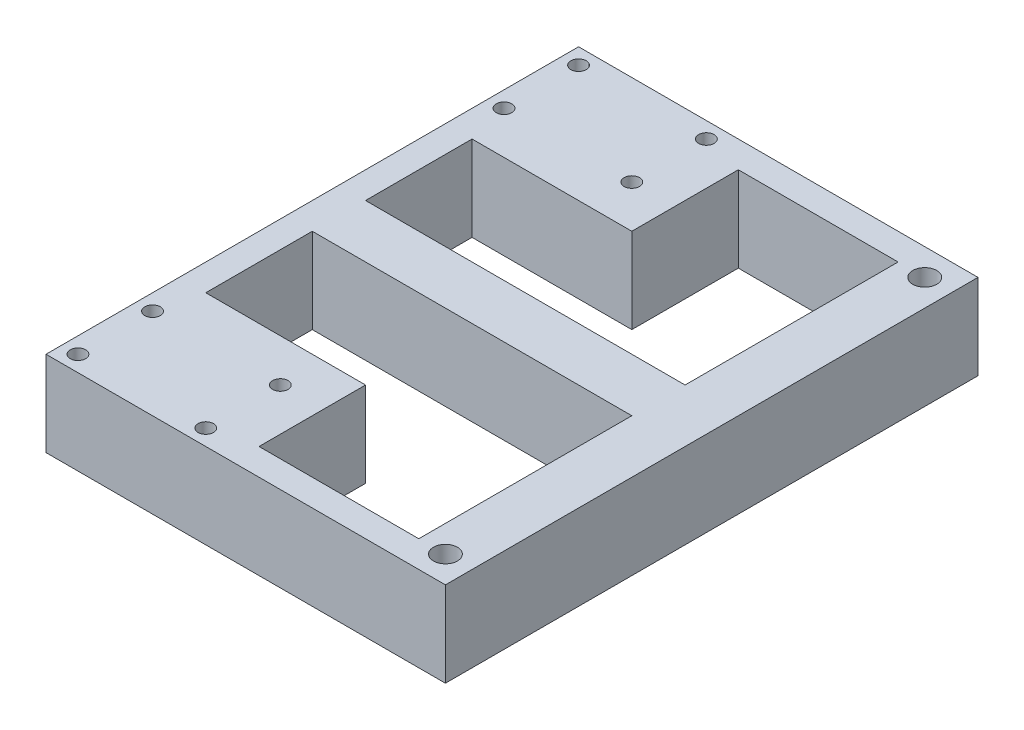
ISO-10303-21;
HEADER;
FILE_DESCRIPTION(('STEP AP214'),'2;1');
FILE_NAME('part.step','',(''),(''),'','','');
FILE_SCHEMA(('AUTOMOTIVE_DESIGN { 1 0 10303 214 1 1 1 1 }'));
ENDSEC;
DATA;
#1=APPLICATION_CONTEXT('core data for automotive mechanical design processes');
#2=APPLICATION_PROTOCOL_DEFINITION('international standard','automotive_design',2000,#1);
#3=PRODUCT_CONTEXT('',#1,'mechanical');
#4=PRODUCT('Part','Part','',(#3));
#5=PRODUCT_RELATED_PRODUCT_CATEGORY('part','',(#4));
#6=PRODUCT_DEFINITION_FORMATION('','',#4);
#7=PRODUCT_DEFINITION_CONTEXT('part definition',#1,'design');
#8=PRODUCT_DEFINITION('design','',#6,#7);
#9=PRODUCT_DEFINITION_SHAPE('','',#8);
#10=(LENGTH_UNIT() NAMED_UNIT(*) SI_UNIT(.MILLI.,.METRE.));
#11=(NAMED_UNIT(*) PLANE_ANGLE_UNIT() SI_UNIT($,.RADIAN.));
#12=(NAMED_UNIT(*) SI_UNIT($,.STERADIAN.) SOLID_ANGLE_UNIT());
#13=UNCERTAINTY_MEASURE_WITH_UNIT(LENGTH_MEASURE(1.E-05),#10,'distance_accuracy_value','');
#14=(GEOMETRIC_REPRESENTATION_CONTEXT(3) GLOBAL_UNCERTAINTY_ASSIGNED_CONTEXT((#13)) GLOBAL_UNIT_ASSIGNED_CONTEXT((#10,
#11,#12)) REPRESENTATION_CONTEXT('',''));
#15=CARTESIAN_POINT('',(0.,0.,0.));
#16=DIRECTION('',(0.,0.,1.));
#17=DIRECTION('',(1.,0.,0.));
#18=AXIS2_PLACEMENT_3D('',#15,#16,#17);
#19=CARTESIAN_POINT('',(0.,16.,0.));
#20=DIRECTION('',(-1.,0.,0.));
#21=DIRECTION('',(0.,0.,1.));
#22=AXIS2_PLACEMENT_3D('',#19,#20,#21);
#23=PLANE('',#22);
#24=DIRECTION('',(0.,0.,-1.));
#25=VECTOR('',#24,1.);
#26=CARTESIAN_POINT('',(0.,0.,0.));
#27=LINE('',#26,#25);
#28=CARTESIAN_POINT('',(0.,0.,0.));
#29=VERTEX_POINT('',#28);
#30=CARTESIAN_POINT('',(0.,0.,-100.));
#31=VERTEX_POINT('',#30);
#32=EDGE_CURVE('E211',#29,#31,#27,.T.);
#33=ORIENTED_EDGE('',*,*,#32,.T.);
#34=DIRECTION('',(0.,-1.,0.));
#35=VECTOR('',#34,1.);
#36=CARTESIAN_POINT('',(0.,16.,-100.));
#37=LINE('',#36,#35);
#38=CARTESIAN_POINT('',(0.,16.,-100.));
#39=VERTEX_POINT('',#38);
#40=EDGE_CURVE('E11',#39,#31,#37,.T.);
#41=ORIENTED_EDGE('',*,*,#40,.F.);
#42=DIRECTION('',(0.,0.,-1.));
#43=VECTOR('',#42,1.);
#44=CARTESIAN_POINT('',(0.,16.,0.));
#45=LINE('',#44,#43);
#46=CARTESIAN_POINT('',(0.,16.,0.));
#47=VERTEX_POINT('',#46);
#48=EDGE_CURVE('E200',#47,#39,#45,.T.);
#49=ORIENTED_EDGE('',*,*,#48,.F.);
#50=DIRECTION('',(0.,-1.,0.));
#51=VECTOR('',#50,1.);
#52=CARTESIAN_POINT('',(0.,16.,0.));
#53=LINE('',#52,#51);
#54=EDGE_CURVE('E210',#47,#29,#53,.T.);
#55=ORIENTED_EDGE('',*,*,#54,.T.);
#56=EDGE_LOOP('',(#33,#41,#49,#55));
#57=FACE_BOUND('',#56,.T.);
#58=ADVANCED_FACE('F34',(#57),#23,.F.);
#59=CARTESIAN_POINT('',(0.,16.,-100.));
#60=DIRECTION('',(0.,0.,1.));
#61=DIRECTION('',(1.,0.,0.));
#62=AXIS2_PLACEMENT_3D('',#59,#60,#61);
#63=PLANE('',#62);
#64=DIRECTION('',(-1.,0.,0.));
#65=VECTOR('',#64,1.);
#66=CARTESIAN_POINT('',(0.,0.,-100.));
#67=LINE('',#66,#65);
#68=CARTESIAN_POINT('',(-75.,0.,-100.));
#69=VERTEX_POINT('',#68);
#70=EDGE_CURVE('E214',#31,#69,#67,.T.);
#71=ORIENTED_EDGE('',*,*,#70,.T.);
#72=DIRECTION('',(0.,-1.,0.));
#73=VECTOR('',#72,1.);
#74=CARTESIAN_POINT('',(-75.,16.,-100.));
#75=LINE('',#74,#73);
#76=CARTESIAN_POINT('',(-75.,16.,-100.));
#77=VERTEX_POINT('',#76);
#78=EDGE_CURVE('E41',#77,#69,#75,.T.);
#79=ORIENTED_EDGE('',*,*,#78,.F.);
#80=DIRECTION('',(-1.,0.,0.));
#81=VECTOR('',#80,1.);
#82=CARTESIAN_POINT('',(0.,16.,-100.));
#83=LINE('',#82,#81);
#84=EDGE_CURVE('E203',#39,#77,#83,.T.);
#85=ORIENTED_EDGE('',*,*,#84,.F.);
#86=ORIENTED_EDGE('',*,*,#40,.T.);
#87=EDGE_LOOP('',(#71,#79,#85,#86));
#88=FACE_BOUND('',#87,.T.);
#89=ADVANCED_FACE('F243',(#88),#63,.F.);
#90=CARTESIAN_POINT('',(-75.,16.,0.));
#91=DIRECTION('',(1.,0.,0.));
#92=DIRECTION('',(0.,0.,-1.));
#93=AXIS2_PLACEMENT_3D('',#90,#91,#92);
#94=PLANE('',#93);
#95=DIRECTION('',(0.,0.,1.));
#96=VECTOR('',#95,1.);
#97=CARTESIAN_POINT('',(-75.,0.,0.));
#98=LINE('',#97,#96);
#99=CARTESIAN_POINT('',(-75.,0.,0.));
#100=VERTEX_POINT('',#99);
#101=EDGE_CURVE('E217',#69,#100,#98,.T.);
#102=ORIENTED_EDGE('',*,*,#101,.T.);
#103=DIRECTION('',(0.,-1.,0.));
#104=VECTOR('',#103,1.);
#105=CARTESIAN_POINT('',(-75.,16.,0.));
#106=LINE('',#105,#104);
#107=CARTESIAN_POINT('',(-75.,16.,0.));
#108=VERTEX_POINT('',#107);
#109=EDGE_CURVE('E222',#108,#100,#106,.T.);
#110=ORIENTED_EDGE('',*,*,#109,.F.);
#111=DIRECTION('',(0.,0.,1.));
#112=VECTOR('',#111,1.);
#113=CARTESIAN_POINT('',(-75.,16.,0.));
#114=LINE('',#113,#112);
#115=EDGE_CURVE('E206',#77,#108,#114,.T.);
#116=ORIENTED_EDGE('',*,*,#115,.F.);
#117=ORIENTED_EDGE('',*,*,#78,.T.);
#118=EDGE_LOOP('',(#102,#110,#116,#117));
#119=FACE_BOUND('',#118,.T.);
#120=ADVANCED_FACE('F229',(#119),#94,.F.);
#121=CARTESIAN_POINT('',(0.,16.,0.));
#122=DIRECTION('',(0.,0.,-1.));
#123=DIRECTION('',(-1.,0.,0.));
#124=AXIS2_PLACEMENT_3D('',#121,#122,#123);
#125=PLANE('',#124);
#126=DIRECTION('',(1.,0.,0.));
#127=VECTOR('',#126,1.);
#128=CARTESIAN_POINT('',(0.,0.,0.));
#129=LINE('',#128,#127);
#130=EDGE_CURVE('E204',#100,#29,#129,.T.);
#131=ORIENTED_EDGE('',*,*,#130,.T.);
#132=ORIENTED_EDGE('',*,*,#54,.F.);
#133=DIRECTION('',(1.,0.,0.));
#134=VECTOR('',#133,1.);
#135=CARTESIAN_POINT('',(0.,16.,0.));
#136=LINE('',#135,#134);
#137=EDGE_CURVE('E208',#108,#47,#136,.T.);
#138=ORIENTED_EDGE('',*,*,#137,.F.);
#139=ORIENTED_EDGE('',*,*,#109,.T.);
#140=EDGE_LOOP('',(#131,#132,#138,#139));
#141=FACE_BOUND('',#140,.T.);
#142=ADVANCED_FACE('F236',(#141),#125,.F.);
#143=CARTESIAN_POINT('',(0.,16.,0.));
#144=DIRECTION('',(0.,1.,0.));
#145=DIRECTION('',(0.,0.,1.));
#146=AXIS2_PLACEMENT_3D('',#143,#144,#145);
#147=PLANE('',#146);
#148=CARTESIAN_POINT('',(-5.,16.,-95.));
#149=DIRECTION('',(0.,1.,0.));
#150=DIRECTION('',(0.,0.,1.));
#151=AXIS2_PLACEMENT_3D('',#148,#149,#150);
#152=CIRCLE('',#151,2.25);
#153=CARTESIAN_POINT('',(-5.,16.,-92.75));
#154=VERTEX_POINT('',#153);
#155=EDGE_CURVE('E387',#154,#154,#152,.T.);
#156=ORIENTED_EDGE('',*,*,#155,.F.);
#157=EDGE_LOOP('',(#156));
#158=FACE_BOUND('',#157,.T.);
#159=CARTESIAN_POINT('',(-5.,16.,-5.));
#160=DIRECTION('',(0.,1.,0.));
#161=DIRECTION('',(0.,0.,-1.));
#162=AXIS2_PLACEMENT_3D('',#159,#160,#161);
#163=CIRCLE('',#162,2.25);
#164=CARTESIAN_POINT('',(-5.,16.,-7.25));
#165=VERTEX_POINT('',#164);
#166=EDGE_CURVE('E370',#165,#165,#163,.T.);
#167=ORIENTED_EDGE('',*,*,#166,.F.);
#168=EDGE_LOOP('',(#167));
#169=FACE_BOUND('',#168,.T.);
#170=DIRECTION('',(-1.,0.,0.));
#171=VECTOR('',#170,1.);
#172=CARTESIAN_POINT('',(-40.,16.,-95.));
#173=LINE('',#172,#171);
#174=CARTESIAN_POINT('',(-9.99999999999999,16.,-95.));
#175=VERTEX_POINT('',#174);
#176=CARTESIAN_POINT('',(-40.,16.,-95.));
#177=VERTEX_POINT('',#176);
#178=EDGE_CURVE('E186',#175,#177,#173,.T.);
#179=ORIENTED_EDGE('',*,*,#178,.F.);
#180=DIRECTION('',(0.,0.,-1.));
#181=VECTOR('',#180,1.);
#182=CARTESIAN_POINT('',(-10.,16.,-55.));
#183=LINE('',#182,#181);
#184=CARTESIAN_POINT('',(-10.,16.,-55.));
#185=VERTEX_POINT('',#184);
#186=EDGE_CURVE('E159',#185,#175,#183,.T.);
#187=ORIENTED_EDGE('',*,*,#186,.F.);
#188=DIRECTION('',(1.,0.,0.));
#189=VECTOR('',#188,1.);
#190=CARTESIAN_POINT('',(-40.,16.,-55.));
#191=LINE('',#190,#189);
#192=CARTESIAN_POINT('',(-70.,16.,-55.));
#193=VERTEX_POINT('',#192);
#194=EDGE_CURVE('E183',#193,#185,#191,.T.);
#195=ORIENTED_EDGE('',*,*,#194,.F.);
#196=DIRECTION('',(0.,0.,1.));
#197=VECTOR('',#196,1.);
#198=CARTESIAN_POINT('',(-70.,16.,-55.));
#199=LINE('',#198,#197);
#200=CARTESIAN_POINT('',(-70.,16.,-75.));
#201=VERTEX_POINT('',#200);
#202=EDGE_CURVE('E180',#201,#193,#199,.T.);
#203=ORIENTED_EDGE('',*,*,#202,.F.);
#204=DIRECTION('',(-1.,0.,0.));
#205=VECTOR('',#204,1.);
#206=CARTESIAN_POINT('',(-40.,16.,-75.));
#207=LINE('',#206,#205);
#208=CARTESIAN_POINT('',(-40.,16.,-75.));
#209=VERTEX_POINT('',#208);
#210=EDGE_CURVE('E177',#209,#201,#207,.T.);
#211=ORIENTED_EDGE('',*,*,#210,.F.);
#212=DIRECTION('',(0.,0.,1.));
#213=VECTOR('',#212,1.);
#214=CARTESIAN_POINT('',(-40.,16.,-75.));
#215=LINE('',#214,#213);
#216=EDGE_CURVE('E170',#177,#209,#215,.T.);
#217=ORIENTED_EDGE('',*,*,#216,.F.);
#218=EDGE_LOOP('',(#179,#187,#195,#203,#211,#217));
#219=FACE_BOUND('',#218,.T.);
#220=DIRECTION('',(-1.,0.,0.));
#221=VECTOR('',#220,1.);
#222=CARTESIAN_POINT('',(-40.,16.,-45.));
#223=LINE('',#222,#221);
#224=CARTESIAN_POINT('',(-10.,16.,-45.));
#225=VERTEX_POINT('',#224);
#226=CARTESIAN_POINT('',(-70.,16.,-45.));
#227=VERTEX_POINT('',#226);
#228=EDGE_CURVE('E470',#225,#227,#223,.T.);
#229=ORIENTED_EDGE('',*,*,#228,.F.);
#230=DIRECTION('',(0.,0.,-1.));
#231=VECTOR('',#230,1.);
#232=CARTESIAN_POINT('',(-10.,16.,-4.99999999999999));
#233=LINE('',#232,#231);
#234=CARTESIAN_POINT('',(-10.,16.,-4.99999999999999));
#235=VERTEX_POINT('',#234);
#236=EDGE_CURVE('E399',#235,#225,#233,.T.);
#237=ORIENTED_EDGE('',*,*,#236,.F.);
#238=DIRECTION('',(1.,0.,0.));
#239=VECTOR('',#238,1.);
#240=CARTESIAN_POINT('',(-40.,16.,-4.99999999999999));
#241=LINE('',#240,#239);
#242=CARTESIAN_POINT('',(-40.,16.,-4.99999999999999));
#243=VERTEX_POINT('',#242);
#244=EDGE_CURVE('E467',#243,#235,#241,.T.);
#245=ORIENTED_EDGE('',*,*,#244,.F.);
#246=DIRECTION('',(0.,0.,1.));
#247=VECTOR('',#246,1.);
#248=CARTESIAN_POINT('',(-40.,16.,-25.));
#249=LINE('',#248,#247);
#250=CARTESIAN_POINT('',(-40.,16.,-25.));
#251=VERTEX_POINT('',#250);
#252=EDGE_CURVE('E464',#251,#243,#249,.T.);
#253=ORIENTED_EDGE('',*,*,#252,.F.);
#254=DIRECTION('',(1.,0.,0.));
#255=VECTOR('',#254,1.);
#256=CARTESIAN_POINT('',(-40.,16.,-25.));
#257=LINE('',#256,#255);
#258=CARTESIAN_POINT('',(-70.,16.,-25.));
#259=VERTEX_POINT('',#258);
#260=EDGE_CURVE('E461',#259,#251,#257,.T.);
#261=ORIENTED_EDGE('',*,*,#260,.F.);
#262=DIRECTION('',(0.,0.,1.));
#263=VECTOR('',#262,1.);
#264=CARTESIAN_POINT('',(-70.,16.,-45.));
#265=LINE('',#264,#263);
#266=EDGE_CURVE('E458',#227,#259,#265,.T.);
#267=ORIENTED_EDGE('',*,*,#266,.F.);
#268=EDGE_LOOP('',(#229,#237,#245,#253,#261,#267));
#269=FACE_BOUND('',#268,.T.);
#270=CARTESIAN_POINT('',(-48.,16.,-17.));
#271=DIRECTION('',(0.,1.,0.));
#272=DIRECTION('',(0.,0.,-1.));
#273=AXIS2_PLACEMENT_3D('',#270,#271,#272);
#274=CIRCLE('',#273,1.45);
#275=CARTESIAN_POINT('',(-48.,16.,-18.45));
#276=VERTEX_POINT('',#275);
#277=EDGE_CURVE('E411',#276,#276,#274,.T.);
#278=ORIENTED_EDGE('',*,*,#277,.F.);
#279=EDGE_LOOP('',(#278));
#280=FACE_BOUND('',#279,.T.);
#281=CARTESIAN_POINT('',(-48.,16.,-83.));
#282=DIRECTION('',(0.,1.,0.));
#283=DIRECTION('',(0.,0.,1.));
#284=AXIS2_PLACEMENT_3D('',#281,#282,#283);
#285=CIRCLE('',#284,1.45);
#286=CARTESIAN_POINT('',(-48.,16.,-81.55));
#287=VERTEX_POINT('',#286);
#288=EDGE_CURVE('E424',#287,#287,#285,.T.);
#289=ORIENTED_EDGE('',*,*,#288,.F.);
#290=EDGE_LOOP('',(#289));
#291=FACE_BOUND('',#290,.T.);
#292=CARTESIAN_POINT('',(-48.,16.,-97.));
#293=DIRECTION('',(0.,1.,0.));
#294=DIRECTION('',(0.,0.,1.));
#295=AXIS2_PLACEMENT_3D('',#292,#293,#294);
#296=CIRCLE('',#295,1.45);
#297=CARTESIAN_POINT('',(-48.,16.,-95.55));
#298=VERTEX_POINT('',#297);
#299=EDGE_CURVE('E423',#298,#298,#296,.T.);
#300=ORIENTED_EDGE('',*,*,#299,.F.);
#301=EDGE_LOOP('',(#300));
#302=FACE_BOUND('',#301,.T.);
#303=CARTESIAN_POINT('',(-72.,16.,-83.));
#304=DIRECTION('',(0.,1.,0.));
#305=DIRECTION('',(0.,0.,1.));
#306=AXIS2_PLACEMENT_3D('',#303,#304,#305);
#307=CIRCLE('',#306,1.45);
#308=CARTESIAN_POINT('',(-72.,16.,-81.55));
#309=VERTEX_POINT('',#308);
#310=EDGE_CURVE('E436',#309,#309,#307,.T.);
#311=ORIENTED_EDGE('',*,*,#310,.F.);
#312=EDGE_LOOP('',(#311));
#313=FACE_BOUND('',#312,.T.);
#314=CARTESIAN_POINT('',(-72.,16.,-2.99999999999999));
#315=DIRECTION('',(0.,1.,0.));
#316=DIRECTION('',(0.,0.,-1.));
#317=AXIS2_PLACEMENT_3D('',#314,#315,#316);
#318=CIRCLE('',#317,1.45);
#319=CARTESIAN_POINT('',(-72.,16.,-4.44999999999999));
#320=VERTEX_POINT('',#319);
#321=EDGE_CURVE('E401',#320,#320,#318,.T.);
#322=ORIENTED_EDGE('',*,*,#321,.F.);
#323=EDGE_LOOP('',(#322));
#324=FACE_BOUND('',#323,.T.);
#325=CARTESIAN_POINT('',(-72.,16.,-17.));
#326=DIRECTION('',(0.,1.,0.));
#327=DIRECTION('',(0.,0.,-1.));
#328=AXIS2_PLACEMENT_3D('',#325,#326,#327);
#329=CIRCLE('',#328,1.45);
#330=CARTESIAN_POINT('',(-72.,16.,-18.45));
#331=VERTEX_POINT('',#330);
#332=EDGE_CURVE('E405',#331,#331,#329,.T.);
#333=ORIENTED_EDGE('',*,*,#332,.F.);
#334=EDGE_LOOP('',(#333));
#335=FACE_BOUND('',#334,.T.);
#336=CARTESIAN_POINT('',(-48.,16.,-2.99999999999999));
#337=DIRECTION('',(0.,1.,0.));
#338=DIRECTION('',(0.,0.,-1.));
#339=AXIS2_PLACEMENT_3D('',#336,#337,#338);
#340=CIRCLE('',#339,1.45);
#341=CARTESIAN_POINT('',(-48.,16.,-4.44999999999999));
#342=VERTEX_POINT('',#341);
#343=EDGE_CURVE('E412',#342,#342,#340,.T.);
#344=ORIENTED_EDGE('',*,*,#343,.F.);
#345=EDGE_LOOP('',(#344));
#346=FACE_BOUND('',#345,.T.);
#347=CARTESIAN_POINT('',(-72.,16.,-97.));
#348=DIRECTION('',(0.,1.,0.));
#349=DIRECTION('',(0.,0.,1.));
#350=AXIS2_PLACEMENT_3D('',#347,#348,#349);
#351=CIRCLE('',#350,1.45);
#352=CARTESIAN_POINT('',(-72.,16.,-95.55));
#353=VERTEX_POINT('',#352);
#354=EDGE_CURVE('E435',#353,#353,#351,.T.);
#355=ORIENTED_EDGE('',*,*,#354,.F.);
#356=EDGE_LOOP('',(#355));
#357=FACE_BOUND('',#356,.T.);
#358=ORIENTED_EDGE('',*,*,#48,.T.);
#359=ORIENTED_EDGE('',*,*,#84,.T.);
#360=ORIENTED_EDGE('',*,*,#115,.T.);
#361=ORIENTED_EDGE('',*,*,#137,.T.);
#362=EDGE_LOOP('',(#358,#359,#360,#361));
#363=FACE_BOUND('',#362,.T.);
#364=ADVANCED_FACE('F242',(#158,#169,#219,#269,#280,#291,#302,#313,#324,#335,#346,#357,#363),
#147,.T.);
#365=CARTESIAN_POINT('',(0.,0.,0.));
#366=DIRECTION('',(0.,1.,0.));
#367=DIRECTION('',(0.,0.,1.));
#368=AXIS2_PLACEMENT_3D('',#365,#366,#367);
#369=PLANE('',#368);
#370=CARTESIAN_POINT('',(-5.,0.,-95.));
#371=DIRECTION('',(0.,-1.,0.));
#372=DIRECTION('',(0.,0.,-1.));
#373=AXIS2_PLACEMENT_3D('',#370,#371,#372);
#374=CIRCLE('',#373,2.25);
#375=CARTESIAN_POINT('',(-5.,0.,-97.25));
#376=VERTEX_POINT('',#375);
#377=EDGE_CURVE('E371',#376,#376,#374,.T.);
#378=ORIENTED_EDGE('',*,*,#377,.F.);
#379=EDGE_LOOP('',(#378));
#380=FACE_BOUND('',#379,.T.);
#381=CARTESIAN_POINT('',(-5.,0.,-5.));
#382=DIRECTION('',(0.,-1.,0.));
#383=DIRECTION('',(0.,0.,-1.));
#384=AXIS2_PLACEMENT_3D('',#381,#382,#383);
#385=CIRCLE('',#384,2.25);
#386=CARTESIAN_POINT('',(-5.,0.,-7.25));
#387=VERTEX_POINT('',#386);
#388=EDGE_CURVE('E382',#387,#387,#385,.T.);
#389=ORIENTED_EDGE('',*,*,#388,.F.);
#390=EDGE_LOOP('',(#389));
#391=FACE_BOUND('',#390,.T.);
#392=CARTESIAN_POINT('',(-48.,0.,-17.));
#393=DIRECTION('',(0.,1.,0.));
#394=DIRECTION('',(0.,0.,-1.));
#395=AXIS2_PLACEMENT_3D('',#392,#393,#394);
#396=CIRCLE('',#395,1.45);
#397=CARTESIAN_POINT('',(-48.,0.,-18.45));
#398=VERTEX_POINT('',#397);
#399=EDGE_CURVE('E427',#398,#398,#396,.T.);
#400=ORIENTED_EDGE('',*,*,#399,.T.);
#401=EDGE_LOOP('',(#400));
#402=FACE_BOUND('',#401,.T.);
#403=CARTESIAN_POINT('',(-48.,0.,-83.));
#404=DIRECTION('',(0.,1.,0.));
#405=DIRECTION('',(0.,0.,1.));
#406=AXIS2_PLACEMENT_3D('',#403,#404,#405);
#407=CIRCLE('',#406,1.45);
#408=CARTESIAN_POINT('',(-48.,0.,-81.55));
#409=VERTEX_POINT('',#408);
#410=EDGE_CURVE('E420',#409,#409,#407,.T.);
#411=ORIENTED_EDGE('',*,*,#410,.T.);
#412=EDGE_LOOP('',(#411));
#413=FACE_BOUND('',#412,.T.);
#414=CARTESIAN_POINT('',(-48.,0.,-97.));
#415=DIRECTION('',(0.,1.,0.));
#416=DIRECTION('',(0.,0.,1.));
#417=AXIS2_PLACEMENT_3D('',#414,#415,#416);
#418=CIRCLE('',#417,1.45);
#419=CARTESIAN_POINT('',(-48.,0.,-95.55));
#420=VERTEX_POINT('',#419);
#421=EDGE_CURVE('E439',#420,#420,#418,.T.);
#422=ORIENTED_EDGE('',*,*,#421,.T.);
#423=EDGE_LOOP('',(#422));
#424=FACE_BOUND('',#423,.T.);
#425=CARTESIAN_POINT('',(-72.,0.,-83.));
#426=DIRECTION('',(0.,1.,0.));
#427=DIRECTION('',(0.,0.,1.));
#428=AXIS2_PLACEMENT_3D('',#425,#426,#427);
#429=CIRCLE('',#428,1.45);
#430=CARTESIAN_POINT('',(-72.,0.,-81.55));
#431=VERTEX_POINT('',#430);
#432=EDGE_CURVE('E432',#431,#431,#429,.T.);
#433=ORIENTED_EDGE('',*,*,#432,.T.);
#434=EDGE_LOOP('',(#433));
#435=FACE_BOUND('',#434,.T.);
#436=CARTESIAN_POINT('',(-72.,0.,-2.99999999999999));
#437=DIRECTION('',(0.,1.,0.));
#438=DIRECTION('',(0.,0.,-1.));
#439=AXIS2_PLACEMENT_3D('',#436,#437,#438);
#440=CIRCLE('',#439,1.45);
#441=CARTESIAN_POINT('',(-72.,0.,-4.44999999999999));
#442=VERTEX_POINT('',#441);
#443=EDGE_CURVE('E402',#442,#442,#440,.T.);
#444=ORIENTED_EDGE('',*,*,#443,.T.);
#445=EDGE_LOOP('',(#444));
#446=FACE_BOUND('',#445,.T.);
#447=CARTESIAN_POINT('',(-72.,0.,-17.));
#448=DIRECTION('',(0.,1.,0.));
#449=DIRECTION('',(0.,0.,-1.));
#450=AXIS2_PLACEMENT_3D('',#447,#448,#449);
#451=CIRCLE('',#450,1.45);
#452=CARTESIAN_POINT('',(-72.,0.,-18.45));
#453=VERTEX_POINT('',#452);
#454=EDGE_CURVE('E415',#453,#453,#451,.T.);
#455=ORIENTED_EDGE('',*,*,#454,.T.);
#456=EDGE_LOOP('',(#455));
#457=FACE_BOUND('',#456,.T.);
#458=CARTESIAN_POINT('',(-48.,0.,-2.99999999999999));
#459=DIRECTION('',(0.,1.,0.));
#460=DIRECTION('',(0.,0.,-1.));
#461=AXIS2_PLACEMENT_3D('',#458,#459,#460);
#462=CIRCLE('',#461,1.45);
#463=CARTESIAN_POINT('',(-48.,0.,-4.44999999999999));
#464=VERTEX_POINT('',#463);
#465=EDGE_CURVE('E408',#464,#464,#462,.T.);
#466=ORIENTED_EDGE('',*,*,#465,.T.);
#467=EDGE_LOOP('',(#466));
#468=FACE_BOUND('',#467,.T.);
#469=CARTESIAN_POINT('',(-72.,0.,-97.));
#470=DIRECTION('',(0.,1.,0.));
#471=DIRECTION('',(0.,0.,1.));
#472=AXIS2_PLACEMENT_3D('',#469,#470,#471);
#473=CIRCLE('',#472,1.45);
#474=CARTESIAN_POINT('',(-72.,0.,-95.55));
#475=VERTEX_POINT('',#474);
#476=EDGE_CURVE('E444',#475,#475,#473,.T.);
#477=ORIENTED_EDGE('',*,*,#476,.T.);
#478=EDGE_LOOP('',(#477));
#479=FACE_BOUND('',#478,.T.);
#480=DIRECTION('',(0.,0.,1.));
#481=VECTOR('',#480,1.);
#482=CARTESIAN_POINT('',(-10.,0.,-45.));
#483=LINE('',#482,#481);
#484=CARTESIAN_POINT('',(-10.,0.,-45.));
#485=VERTEX_POINT('',#484);
#486=CARTESIAN_POINT('',(-10.,0.,-4.99999999999999));
#487=VERTEX_POINT('',#486);
#488=EDGE_CURVE('E56',#485,#487,#483,.T.);
#489=ORIENTED_EDGE('',*,*,#488,.F.);
#490=DIRECTION('',(1.,0.,0.));
#491=VECTOR('',#490,1.);
#492=CARTESIAN_POINT('',(-40.,0.,-45.));
#493=LINE('',#492,#491);
#494=CARTESIAN_POINT('',(-70.,0.,-45.));
#495=VERTEX_POINT('',#494);
#496=EDGE_CURVE('E455',#495,#485,#493,.T.);
#497=ORIENTED_EDGE('',*,*,#496,.F.);
#498=DIRECTION('',(0.,0.,-1.));
#499=VECTOR('',#498,1.);
#500=CARTESIAN_POINT('',(-70.,0.,-45.));
#501=LINE('',#500,#499);
#502=CARTESIAN_POINT('',(-70.,0.,-25.));
#503=VERTEX_POINT('',#502);
#504=EDGE_CURVE('E215',#503,#495,#501,.T.);
#505=ORIENTED_EDGE('',*,*,#504,.F.);
#506=DIRECTION('',(-1.,0.,0.));
#507=VECTOR('',#506,1.);
#508=CARTESIAN_POINT('',(-40.,0.,-25.));
#509=LINE('',#508,#507);
#510=CARTESIAN_POINT('',(-40.,0.,-25.));
#511=VERTEX_POINT('',#510);
#512=EDGE_CURVE('E199',#511,#503,#509,.T.);
#513=ORIENTED_EDGE('',*,*,#512,.F.);
#514=DIRECTION('',(0.,0.,-1.));
#515=VECTOR('',#514,1.);
#516=CARTESIAN_POINT('',(-40.,0.,-25.));
#517=LINE('',#516,#515);
#518=CARTESIAN_POINT('',(-40.,0.,-4.99999999999999));
#519=VERTEX_POINT('',#518);
#520=EDGE_CURVE('E450',#519,#511,#517,.T.);
#521=ORIENTED_EDGE('',*,*,#520,.F.);
#522=DIRECTION('',(-1.,0.,0.));
#523=VECTOR('',#522,1.);
#524=CARTESIAN_POINT('',(-40.,0.,-4.99999999999999));
#525=LINE('',#524,#523);
#526=EDGE_CURVE('E453',#487,#519,#525,.T.);
#527=ORIENTED_EDGE('',*,*,#526,.F.);
#528=EDGE_LOOP('',(#489,#497,#505,#513,#521,#527));
#529=FACE_BOUND('',#528,.T.);
#530=DIRECTION('',(1.,0.,0.));
#531=VECTOR('',#530,1.);
#532=CARTESIAN_POINT('',(-40.,0.,-95.));
#533=LINE('',#532,#531);
#534=CARTESIAN_POINT('',(-40.,0.,-95.));
#535=VERTEX_POINT('',#534);
#536=CARTESIAN_POINT('',(-9.99999999999999,0.,-95.));
#537=VERTEX_POINT('',#536);
#538=EDGE_CURVE('E150',#535,#537,#533,.T.);
#539=ORIENTED_EDGE('',*,*,#538,.F.);
#540=DIRECTION('',(0.,0.,-1.));
#541=VECTOR('',#540,1.);
#542=CARTESIAN_POINT('',(-40.,0.,-75.));
#543=LINE('',#542,#541);
#544=CARTESIAN_POINT('',(-40.,0.,-75.));
#545=VERTEX_POINT('',#544);
#546=EDGE_CURVE('E168',#545,#535,#543,.T.);
#547=ORIENTED_EDGE('',*,*,#546,.F.);
#548=DIRECTION('',(1.,0.,0.));
#549=VECTOR('',#548,1.);
#550=CARTESIAN_POINT('',(-40.,0.,-75.));
#551=LINE('',#550,#549);
#552=CARTESIAN_POINT('',(-70.,0.,-75.));
#553=VERTEX_POINT('',#552);
#554=EDGE_CURVE('E190',#553,#545,#551,.T.);
#555=ORIENTED_EDGE('',*,*,#554,.F.);
#556=DIRECTION('',(0.,0.,-1.));
#557=VECTOR('',#556,1.);
#558=CARTESIAN_POINT('',(-70.,0.,-55.));
#559=LINE('',#558,#557);
#560=CARTESIAN_POINT('',(-70.,0.,-55.));
#561=VERTEX_POINT('',#560);
#562=EDGE_CURVE('E172',#561,#553,#559,.T.);
#563=ORIENTED_EDGE('',*,*,#562,.F.);
#564=DIRECTION('',(-1.,0.,0.));
#565=VECTOR('',#564,1.);
#566=CARTESIAN_POINT('',(-40.,0.,-55.));
#567=LINE('',#566,#565);
#568=CARTESIAN_POINT('',(-10.,0.,-55.));
#569=VERTEX_POINT('',#568);
#570=EDGE_CURVE('E152',#569,#561,#567,.T.);
#571=ORIENTED_EDGE('',*,*,#570,.F.);
#572=DIRECTION('',(0.,0.,1.));
#573=VECTOR('',#572,1.);
#574=CARTESIAN_POINT('',(-9.99999999999999,0.,-95.));
#575=LINE('',#574,#573);
#576=EDGE_CURVE('E48',#537,#569,#575,.T.);
#577=ORIENTED_EDGE('',*,*,#576,.F.);
#578=EDGE_LOOP('',(#539,#547,#555,#563,#571,#577));
#579=FACE_BOUND('',#578,.T.);
#580=ORIENTED_EDGE('',*,*,#32,.F.);
#581=ORIENTED_EDGE('',*,*,#130,.F.);
#582=ORIENTED_EDGE('',*,*,#101,.F.);
#583=ORIENTED_EDGE('',*,*,#70,.F.);
#584=EDGE_LOOP('',(#580,#581,#582,#583));
#585=FACE_BOUND('',#584,.T.);
#586=ADVANCED_FACE('F146',(#380,#391,#402,#413,#424,#435,#446,#457,#468,#479,#529,#579,#585),
#369,.F.);
#587=CARTESIAN_POINT('',(-40.,-0.001000000000001,-75.));
#588=DIRECTION('',(-1.,0.,0.));
#589=DIRECTION('',(0.,0.,1.));
#590=AXIS2_PLACEMENT_3D('',#587,#588,#589);
#591=PLANE('',#590);
#592=ORIENTED_EDGE('',*,*,#546,.T.);
#593=DIRECTION('',(0.,1.,0.));
#594=VECTOR('',#593,1.);
#595=CARTESIAN_POINT('',(-40.,-0.001000000000001,-95.));
#596=LINE('',#595,#594);
#597=EDGE_CURVE('E166',#535,#177,#596,.T.);
#598=ORIENTED_EDGE('',*,*,#597,.T.);
#599=ORIENTED_EDGE('',*,*,#216,.T.);
#600=DIRECTION('',(0.,1.,0.));
#601=VECTOR('',#600,1.);
#602=CARTESIAN_POINT('',(-40.,-0.001000000000001,-75.));
#603=LINE('',#602,#601);
#604=EDGE_CURVE('E188',#545,#209,#603,.T.);
#605=ORIENTED_EDGE('',*,*,#604,.F.);
#606=EDGE_LOOP('',(#592,#598,#599,#605));
#607=FACE_BOUND('',#606,.T.);
#608=ADVANCED_FACE('F255',(#607),#591,.F.);
#609=CARTESIAN_POINT('',(-40.,-0.001000000000001,-95.));
#610=DIRECTION('',(0.,0.,-1.));
#611=DIRECTION('',(-1.,0.,0.));
#612=AXIS2_PLACEMENT_3D('',#609,#610,#611);
#613=PLANE('',#612);
#614=ORIENTED_EDGE('',*,*,#538,.T.);
#615=DIRECTION('',(0.,-1.,0.));
#616=VECTOR('',#615,1.);
#617=CARTESIAN_POINT('',(-9.99999999999999,16.,-95.));
#618=LINE('',#617,#616);
#619=EDGE_CURVE('E154',#175,#537,#618,.T.);
#620=ORIENTED_EDGE('',*,*,#619,.F.);
#621=ORIENTED_EDGE('',*,*,#178,.T.);
#622=ORIENTED_EDGE('',*,*,#597,.F.);
#623=EDGE_LOOP('',(#614,#620,#621,#622));
#624=FACE_BOUND('',#623,.T.);
#625=ADVANCED_FACE('F164',(#624),#613,.F.);
#626=CARTESIAN_POINT('',(-40.,-0.001000000000001,-55.));
#627=DIRECTION('',(0.,0.,1.));
#628=DIRECTION('',(1.,0.,0.));
#629=AXIS2_PLACEMENT_3D('',#626,#627,#628);
#630=PLANE('',#629);
#631=ORIENTED_EDGE('',*,*,#194,.T.);
#632=DIRECTION('',(0.,1.,0.));
#633=VECTOR('',#632,1.);
#634=CARTESIAN_POINT('',(-10.,0.,-55.));
#635=LINE('',#634,#633);
#636=EDGE_CURVE('E153',#569,#185,#635,.T.);
#637=ORIENTED_EDGE('',*,*,#636,.F.);
#638=ORIENTED_EDGE('',*,*,#570,.T.);
#639=DIRECTION('',(0.,1.,0.));
#640=VECTOR('',#639,1.);
#641=CARTESIAN_POINT('',(-70.,-0.001000000000001,-55.));
#642=LINE('',#641,#640);
#643=EDGE_CURVE('E191',#561,#193,#642,.T.);
#644=ORIENTED_EDGE('',*,*,#643,.T.);
#645=EDGE_LOOP('',(#631,#637,#638,#644));
#646=FACE_BOUND('',#645,.T.);
#647=ADVANCED_FACE('F271',(#646),#630,.F.);
#648=CARTESIAN_POINT('',(-70.,-0.001000000000001,-55.));
#649=DIRECTION('',(-1.,0.,0.));
#650=DIRECTION('',(0.,0.,1.));
#651=AXIS2_PLACEMENT_3D('',#648,#649,#650);
#652=PLANE('',#651);
#653=ORIENTED_EDGE('',*,*,#562,.T.);
#654=DIRECTION('',(0.,1.,0.));
#655=VECTOR('',#654,1.);
#656=CARTESIAN_POINT('',(-70.,-0.001000000000001,-75.));
#657=LINE('',#656,#655);
#658=EDGE_CURVE('E193',#553,#201,#657,.T.);
#659=ORIENTED_EDGE('',*,*,#658,.T.);
#660=ORIENTED_EDGE('',*,*,#202,.T.);
#661=ORIENTED_EDGE('',*,*,#643,.F.);
#662=EDGE_LOOP('',(#653,#659,#660,#661));
#663=FACE_BOUND('',#662,.T.);
#664=ADVANCED_FACE('F267',(#663),#652,.F.);
#665=CARTESIAN_POINT('',(-40.,-0.001000000000001,-75.));
#666=DIRECTION('',(0.,0.,-1.));
#667=DIRECTION('',(-1.,0.,0.));
#668=AXIS2_PLACEMENT_3D('',#665,#666,#667);
#669=PLANE('',#668);
#670=ORIENTED_EDGE('',*,*,#554,.T.);
#671=ORIENTED_EDGE('',*,*,#604,.T.);
#672=ORIENTED_EDGE('',*,*,#210,.T.);
#673=ORIENTED_EDGE('',*,*,#658,.F.);
#674=EDGE_LOOP('',(#670,#671,#672,#673));
#675=FACE_BOUND('',#674,.T.);
#676=ADVANCED_FACE('F263',(#675),#669,.F.);
#677=CARTESIAN_POINT('',(-40.,-0.001000000000001,-45.));
#678=DIRECTION('',(0.,0.,-1.));
#679=DIRECTION('',(-1.,0.,0.));
#680=AXIS2_PLACEMENT_3D('',#677,#678,#679);
#681=PLANE('',#680);
#682=ORIENTED_EDGE('',*,*,#496,.T.);
#683=DIRECTION('',(0.,-1.,0.));
#684=VECTOR('',#683,1.);
#685=CARTESIAN_POINT('',(-10.,16.,-45.));
#686=LINE('',#685,#684);
#687=EDGE_CURVE('E394',#225,#485,#686,.T.);
#688=ORIENTED_EDGE('',*,*,#687,.F.);
#689=ORIENTED_EDGE('',*,*,#228,.T.);
#690=DIRECTION('',(0.,1.,0.));
#691=VECTOR('',#690,1.);
#692=CARTESIAN_POINT('',(-70.,-0.001000000000001,-45.));
#693=LINE('',#692,#691);
#694=EDGE_CURVE('E472',#495,#227,#693,.T.);
#695=ORIENTED_EDGE('',*,*,#694,.F.);
#696=EDGE_LOOP('',(#682,#688,#689,#695));
#697=FACE_BOUND('',#696,.T.);
#698=ADVANCED_FACE('F266',(#697),#681,.F.);
#699=CARTESIAN_POINT('',(-40.,-0.001000000000001,-4.99999999999999));
#700=DIRECTION('',(0.,0.,1.));
#701=DIRECTION('',(1.,0.,0.));
#702=AXIS2_PLACEMENT_3D('',#699,#700,#701);
#703=PLANE('',#702);
#704=ORIENTED_EDGE('',*,*,#244,.T.);
#705=DIRECTION('',(0.,1.,0.));
#706=VECTOR('',#705,1.);
#707=CARTESIAN_POINT('',(-10.,0.,-4.99999999999999));
#708=LINE('',#707,#706);
#709=EDGE_CURVE('E397',#487,#235,#708,.T.);
#710=ORIENTED_EDGE('',*,*,#709,.F.);
#711=ORIENTED_EDGE('',*,*,#526,.T.);
#712=DIRECTION('',(0.,1.,0.));
#713=VECTOR('',#712,1.);
#714=CARTESIAN_POINT('',(-40.,-0.001000000000001,-4.99999999999999));
#715=LINE('',#714,#713);
#716=EDGE_CURVE('E473',#519,#243,#715,.T.);
#717=ORIENTED_EDGE('',*,*,#716,.T.);
#718=EDGE_LOOP('',(#704,#710,#711,#717));
#719=FACE_BOUND('',#718,.T.);
#720=ADVANCED_FACE('F290',(#719),#703,.F.);
#721=CARTESIAN_POINT('',(-40.,-0.001000000000001,-25.));
#722=DIRECTION('',(-1.,0.,0.));
#723=DIRECTION('',(0.,0.,1.));
#724=AXIS2_PLACEMENT_3D('',#721,#722,#723);
#725=PLANE('',#724);
#726=ORIENTED_EDGE('',*,*,#520,.T.);
#727=DIRECTION('',(0.,1.,0.));
#728=VECTOR('',#727,1.);
#729=CARTESIAN_POINT('',(-40.,-0.001000000000001,-25.));
#730=LINE('',#729,#728);
#731=EDGE_CURVE('E475',#511,#251,#730,.T.);
#732=ORIENTED_EDGE('',*,*,#731,.T.);
#733=ORIENTED_EDGE('',*,*,#252,.T.);
#734=ORIENTED_EDGE('',*,*,#716,.F.);
#735=EDGE_LOOP('',(#726,#732,#733,#734));
#736=FACE_BOUND('',#735,.T.);
#737=ADVANCED_FACE('F286',(#736),#725,.F.);
#738=CARTESIAN_POINT('',(-40.,-0.001000000000001,-25.));
#739=DIRECTION('',(0.,0.,1.));
#740=DIRECTION('',(1.,0.,0.));
#741=AXIS2_PLACEMENT_3D('',#738,#739,#740);
#742=PLANE('',#741);
#743=ORIENTED_EDGE('',*,*,#512,.T.);
#744=DIRECTION('',(0.,1.,0.));
#745=VECTOR('',#744,1.);
#746=CARTESIAN_POINT('',(-70.,-0.001000000000001,-25.));
#747=LINE('',#746,#745);
#748=EDGE_CURVE('E477',#503,#259,#747,.T.);
#749=ORIENTED_EDGE('',*,*,#748,.T.);
#750=ORIENTED_EDGE('',*,*,#260,.T.);
#751=ORIENTED_EDGE('',*,*,#731,.F.);
#752=EDGE_LOOP('',(#743,#749,#750,#751));
#753=FACE_BOUND('',#752,.T.);
#754=ADVANCED_FACE('F282',(#753),#742,.F.);
#755=CARTESIAN_POINT('',(-70.,-0.001000000000001,-45.));
#756=DIRECTION('',(-1.,0.,0.));
#757=DIRECTION('',(0.,0.,1.));
#758=AXIS2_PLACEMENT_3D('',#755,#756,#757);
#759=PLANE('',#758);
#760=ORIENTED_EDGE('',*,*,#504,.T.);
#761=ORIENTED_EDGE('',*,*,#694,.T.);
#762=ORIENTED_EDGE('',*,*,#266,.T.);
#763=ORIENTED_EDGE('',*,*,#748,.F.);
#764=EDGE_LOOP('',(#760,#761,#762,#763));
#765=FACE_BOUND('',#764,.T.);
#766=ADVANCED_FACE('F278',(#765),#759,.F.);
#767=CARTESIAN_POINT('',(-72.,0.,-97.));
#768=DIRECTION('',(0.,1.,0.));
#769=DIRECTION('',(0.,0.,1.));
#770=AXIS2_PLACEMENT_3D('',#767,#768,#769);
#771=CYLINDRICAL_SURFACE('',#770,1.45);
#772=ORIENTED_EDGE('',*,*,#476,.F.);
#773=EDGE_LOOP('',(#772));
#774=FACE_BOUND('',#773,.T.);
#775=ORIENTED_EDGE('',*,*,#354,.T.);
#776=EDGE_LOOP('',(#775));
#777=FACE_BOUND('',#776,.T.);
#778=ADVANCED_FACE('F281',(#774,#777),#771,.F.);
#779=CARTESIAN_POINT('',(-48.,0.,-2.99999999999999));
#780=DIRECTION('',(0.,1.,0.));
#781=DIRECTION('',(0.,0.,1.));
#782=AXIS2_PLACEMENT_3D('',#779,#780,#781);
#783=CYLINDRICAL_SURFACE('',#782,1.45);
#784=ORIENTED_EDGE('',*,*,#465,.F.);
#785=EDGE_LOOP('',(#784));
#786=FACE_BOUND('',#785,.T.);
#787=ORIENTED_EDGE('',*,*,#343,.T.);
#788=EDGE_LOOP('',(#787));
#789=FACE_BOUND('',#788,.T.);
#790=ADVANCED_FACE('F300',(#786,#789),#783,.F.);
#791=CARTESIAN_POINT('',(-72.,0.,-17.));
#792=DIRECTION('',(0.,1.,0.));
#793=DIRECTION('',(0.,0.,1.));
#794=AXIS2_PLACEMENT_3D('',#791,#792,#793);
#795=CYLINDRICAL_SURFACE('',#794,1.45);
#796=ORIENTED_EDGE('',*,*,#454,.F.);
#797=EDGE_LOOP('',(#796));
#798=FACE_BOUND('',#797,.T.);
#799=ORIENTED_EDGE('',*,*,#332,.T.);
#800=EDGE_LOOP('',(#799));
#801=FACE_BOUND('',#800,.T.);
#802=ADVANCED_FACE('F320',(#798,#801),#795,.F.);
#803=CARTESIAN_POINT('',(-72.,0.,-2.99999999999999));
#804=DIRECTION('',(0.,1.,0.));
#805=DIRECTION('',(0.,0.,1.));
#806=AXIS2_PLACEMENT_3D('',#803,#804,#805);
#807=CYLINDRICAL_SURFACE('',#806,1.45);
#808=ORIENTED_EDGE('',*,*,#443,.F.);
#809=EDGE_LOOP('',(#808));
#810=FACE_BOUND('',#809,.T.);
#811=ORIENTED_EDGE('',*,*,#321,.T.);
#812=EDGE_LOOP('',(#811));
#813=FACE_BOUND('',#812,.T.);
#814=ADVANCED_FACE('F310',(#810,#813),#807,.F.);
#815=CARTESIAN_POINT('',(-72.,0.,-83.));
#816=DIRECTION('',(0.,1.,0.));
#817=DIRECTION('',(0.,0.,1.));
#818=AXIS2_PLACEMENT_3D('',#815,#816,#817);
#819=CYLINDRICAL_SURFACE('',#818,1.45);
#820=ORIENTED_EDGE('',*,*,#432,.F.);
#821=EDGE_LOOP('',(#820));
#822=FACE_BOUND('',#821,.T.);
#823=ORIENTED_EDGE('',*,*,#310,.T.);
#824=EDGE_LOOP('',(#823));
#825=FACE_BOUND('',#824,.T.);
#826=ADVANCED_FACE('F306',(#822,#825),#819,.F.);
#827=CARTESIAN_POINT('',(-48.,0.,-97.));
#828=DIRECTION('',(0.,1.,0.));
#829=DIRECTION('',(0.,0.,1.));
#830=AXIS2_PLACEMENT_3D('',#827,#828,#829);
#831=CYLINDRICAL_SURFACE('',#830,1.45);
#832=ORIENTED_EDGE('',*,*,#421,.F.);
#833=EDGE_LOOP('',(#832));
#834=FACE_BOUND('',#833,.T.);
#835=ORIENTED_EDGE('',*,*,#299,.T.);
#836=EDGE_LOOP('',(#835));
#837=FACE_BOUND('',#836,.T.);
#838=ADVANCED_FACE('F302',(#834,#837),#831,.F.);
#839=CARTESIAN_POINT('',(-48.,0.,-83.));
#840=DIRECTION('',(0.,1.,0.));
#841=DIRECTION('',(0.,0.,1.));
#842=AXIS2_PLACEMENT_3D('',#839,#840,#841);
#843=CYLINDRICAL_SURFACE('',#842,1.45);
#844=ORIENTED_EDGE('',*,*,#410,.F.);
#845=EDGE_LOOP('',(#844));
#846=FACE_BOUND('',#845,.T.);
#847=ORIENTED_EDGE('',*,*,#288,.T.);
#848=EDGE_LOOP('',(#847));
#849=FACE_BOUND('',#848,.T.);
#850=ADVANCED_FACE('F305',(#846,#849),#843,.F.);
#851=CARTESIAN_POINT('',(-48.,0.,-17.));
#852=DIRECTION('',(0.,1.,0.));
#853=DIRECTION('',(0.,0.,1.));
#854=AXIS2_PLACEMENT_3D('',#851,#852,#853);
#855=CYLINDRICAL_SURFACE('',#854,1.45);
#856=ORIENTED_EDGE('',*,*,#399,.F.);
#857=EDGE_LOOP('',(#856));
#858=FACE_BOUND('',#857,.T.);
#859=ORIENTED_EDGE('',*,*,#277,.T.);
#860=EDGE_LOOP('',(#859));
#861=FACE_BOUND('',#860,.T.);
#862=ADVANCED_FACE('F312',(#858,#861),#855,.F.);
#863=CARTESIAN_POINT('',(-10.,0.,0.));
#864=DIRECTION('',(-1.,0.,0.));
#865=DIRECTION('',(0.,0.,1.));
#866=AXIS2_PLACEMENT_3D('',#863,#864,#865);
#867=PLANE('',#866);
#868=ORIENTED_EDGE('',*,*,#687,.T.);
#869=ORIENTED_EDGE('',*,*,#488,.T.);
#870=ORIENTED_EDGE('',*,*,#709,.T.);
#871=ORIENTED_EDGE('',*,*,#236,.T.);
#872=EDGE_LOOP('',(#868,#869,#870,#871));
#873=FACE_BOUND('',#872,.T.);
#874=ADVANCED_FACE('F315',(#873),#867,.T.);
#875=CARTESIAN_POINT('',(-10.,0.,0.));
#876=DIRECTION('',(-1.,0.,0.));
#877=DIRECTION('',(0.,0.,1.));
#878=AXIS2_PLACEMENT_3D('',#875,#876,#877);
#879=PLANE('',#878);
#880=ORIENTED_EDGE('',*,*,#619,.T.);
#881=ORIENTED_EDGE('',*,*,#576,.T.);
#882=ORIENTED_EDGE('',*,*,#636,.T.);
#883=ORIENTED_EDGE('',*,*,#186,.T.);
#884=EDGE_LOOP('',(#880,#881,#882,#883));
#885=FACE_BOUND('',#884,.T.);
#886=ADVANCED_FACE('F157',(#885),#879,.T.);
#887=CARTESIAN_POINT('',(-5.,11.,-5.));
#888=DIRECTION('',(0.,1.,0.));
#889=DIRECTION('',(0.,0.,1.));
#890=AXIS2_PLACEMENT_3D('',#887,#888,#889);
#891=CYLINDRICAL_SURFACE('',#890,2.25);
#892=CARTESIAN_POINT('',(-5.,11.,-5.));
#893=DIRECTION('',(0.,1.,0.));
#894=DIRECTION('',(0.,0.,-1.));
#895=AXIS2_PLACEMENT_3D('',#892,#893,#894);
#896=CIRCLE('',#895,2.25);
#897=CARTESIAN_POINT('',(-5.,11.,-7.25));
#898=VERTEX_POINT('',#897);
#899=EDGE_CURVE('E374',#898,#898,#896,.T.);
#900=ORIENTED_EDGE('',*,*,#899,.F.);
#901=EDGE_LOOP('',(#900));
#902=FACE_BOUND('',#901,.T.);
#903=ORIENTED_EDGE('',*,*,#166,.T.);
#904=EDGE_LOOP('',(#903));
#905=FACE_BOUND('',#904,.T.);
#906=ADVANCED_FACE('F334',(#902,#905),#891,.F.);
#907=CARTESIAN_POINT('',(-5.,11.,-5.));
#908=DIRECTION('',(0.,-1.,0.));
#909=DIRECTION('',(0.,0.,-1.));
#910=AXIS2_PLACEMENT_3D('',#907,#908,#909);
#911=PLANE('',#910);
#912=ORIENTED_EDGE('',*,*,#899,.T.);
#913=EDGE_LOOP('',(#912));
#914=FACE_BOUND('',#913,.T.);
#915=ADVANCED_FACE('F337',(#914),#911,.F.);
#916=CARTESIAN_POINT('',(-5.,11.,-95.));
#917=DIRECTION('',(0.,1.,0.));
#918=DIRECTION('',(0.,0.,1.));
#919=AXIS2_PLACEMENT_3D('',#916,#917,#918);
#920=CYLINDRICAL_SURFACE('',#919,2.25);
#921=CARTESIAN_POINT('',(-5.,11.,-95.));
#922=DIRECTION('',(0.,1.,0.));
#923=DIRECTION('',(0.,0.,1.));
#924=AXIS2_PLACEMENT_3D('',#921,#922,#923);
#925=CIRCLE('',#924,2.25);
#926=CARTESIAN_POINT('',(-5.,11.,-92.75));
#927=VERTEX_POINT('',#926);
#928=EDGE_CURVE('E162',#927,#927,#925,.T.);
#929=ORIENTED_EDGE('',*,*,#928,.F.);
#930=EDGE_LOOP('',(#929));
#931=FACE_BOUND('',#930,.T.);
#932=ORIENTED_EDGE('',*,*,#155,.T.);
#933=EDGE_LOOP('',(#932));
#934=FACE_BOUND('',#933,.T.);
#935=ADVANCED_FACE('F341',(#931,#934),#920,.F.);
#936=CARTESIAN_POINT('',(-5.,11.,-95.));
#937=DIRECTION('',(0.,1.,0.));
#938=DIRECTION('',(0.,0.,1.));
#939=AXIS2_PLACEMENT_3D('',#936,#937,#938);
#940=PLANE('',#939);
#941=ORIENTED_EDGE('',*,*,#928,.T.);
#942=EDGE_LOOP('',(#941));
#943=FACE_BOUND('',#942,.T.);
#944=ADVANCED_FACE('F345',(#943),#940,.T.);
#945=CARTESIAN_POINT('',(-5.,5.,-5.));
#946=DIRECTION('',(0.,-1.,0.));
#947=DIRECTION('',(0.,0.,-1.));
#948=AXIS2_PLACEMENT_3D('',#945,#946,#947);
#949=CYLINDRICAL_SURFACE('',#948,2.25);
#950=CARTESIAN_POINT('',(-5.,5.,-5.));
#951=DIRECTION('',(0.,-1.,0.));
#952=DIRECTION('',(0.,0.,-1.));
#953=AXIS2_PLACEMENT_3D('',#950,#951,#952);
#954=CIRCLE('',#953,2.25);
#955=CARTESIAN_POINT('',(-5.,5.,-7.25));
#956=VERTEX_POINT('',#955);
#957=EDGE_CURVE('E377',#956,#956,#954,.T.);
#958=ORIENTED_EDGE('',*,*,#957,.F.);
#959=EDGE_LOOP('',(#958));
#960=FACE_BOUND('',#959,.T.);
#961=ORIENTED_EDGE('',*,*,#388,.T.);
#962=EDGE_LOOP('',(#961));
#963=FACE_BOUND('',#962,.T.);
#964=ADVANCED_FACE('F349',(#960,#963),#949,.F.);
#965=CARTESIAN_POINT('',(-5.,5.,-5.));
#966=DIRECTION('',(0.,-1.,0.));
#967=DIRECTION('',(0.,0.,-1.));
#968=AXIS2_PLACEMENT_3D('',#965,#966,#967);
#969=PLANE('',#968);
#970=ORIENTED_EDGE('',*,*,#957,.T.);
#971=EDGE_LOOP('',(#970));
#972=FACE_BOUND('',#971,.T.);
#973=ADVANCED_FACE('F353',(#972),#969,.T.);
#974=CARTESIAN_POINT('',(-5.,5.,-95.));
#975=DIRECTION('',(0.,-1.,0.));
#976=DIRECTION('',(0.,0.,-1.));
#977=AXIS2_PLACEMENT_3D('',#974,#975,#976);
#978=CYLINDRICAL_SURFACE('',#977,2.25);
#979=CARTESIAN_POINT('',(-5.,5.,-95.));
#980=DIRECTION('',(0.,-1.,0.));
#981=DIRECTION('',(0.,0.,-1.));
#982=AXIS2_PLACEMENT_3D('',#979,#980,#981);
#983=CIRCLE('',#982,2.25);
#984=CARTESIAN_POINT('',(-5.,5.,-97.25));
#985=VERTEX_POINT('',#984);
#986=EDGE_CURVE('E369',#985,#985,#983,.T.);
#987=ORIENTED_EDGE('',*,*,#986,.F.);
#988=EDGE_LOOP('',(#987));
#989=FACE_BOUND('',#988,.T.);
#990=ORIENTED_EDGE('',*,*,#377,.T.);
#991=EDGE_LOOP('',(#990));
#992=FACE_BOUND('',#991,.T.);
#993=ADVANCED_FACE('F357',(#989,#992),#978,.F.);
#994=CARTESIAN_POINT('',(-5.,5.,-95.));
#995=DIRECTION('',(0.,-1.,0.));
#996=DIRECTION('',(0.,0.,-1.));
#997=AXIS2_PLACEMENT_3D('',#994,#995,#996);
#998=PLANE('',#997);
#999=ORIENTED_EDGE('',*,*,#986,.T.);
#1000=EDGE_LOOP('',(#999));
#1001=FACE_BOUND('',#1000,.T.);
#1002=ADVANCED_FACE('F361',(#1001),#998,.T.);
#1003=CLOSED_SHELL('',(#58,#89,#120,#142,#364,#586,#608,#625,#647,#664,#676,#698,#720,#737,#754,
#766,#778,#790,#802,#814,#826,#838,#850,#862,#874,#886,#906,#915,#935,#944,#964,#973,#993,#1002));
#1004=MANIFOLD_SOLID_BREP('B2',#1003);
#1005=ADVANCED_BREP_SHAPE_REPRESENTATION('',(#18,#1004),#14);
#1006=SHAPE_DEFINITION_REPRESENTATION(#9,#1005);
ENDSEC;
END-ISO-10303-21;
